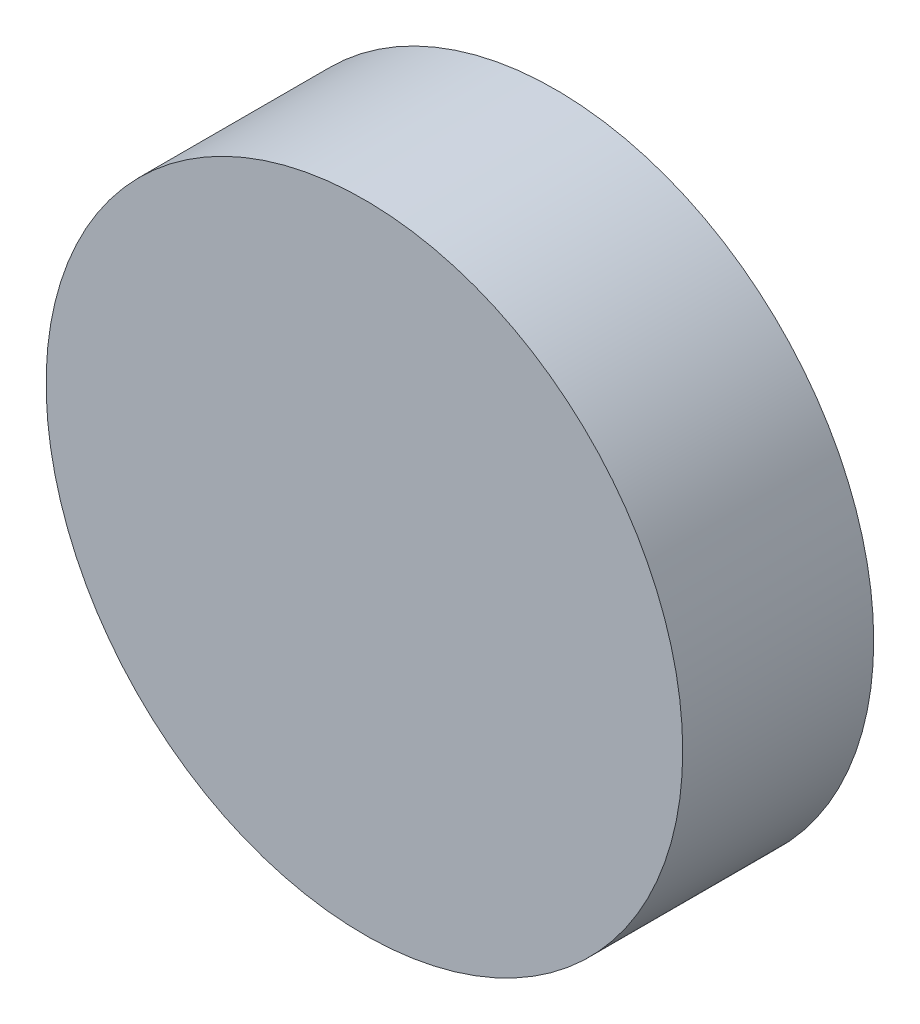
ISO-10303-21;
HEADER;
FILE_DESCRIPTION(('STEP AP214'),'2;1');
FILE_NAME('part.step','',(''),(''),'','','');
FILE_SCHEMA(('AUTOMOTIVE_DESIGN { 1 0 10303 214 1 1 1 1 }'));
ENDSEC;
DATA;
#1=APPLICATION_CONTEXT('core data for automotive mechanical design processes');
#2=APPLICATION_PROTOCOL_DEFINITION('international standard','automotive_design',2000,#1);
#3=PRODUCT_CONTEXT('',#1,'mechanical');
#4=PRODUCT('Part','Part','',(#3));
#5=PRODUCT_RELATED_PRODUCT_CATEGORY('part','',(#4));
#6=PRODUCT_DEFINITION_FORMATION('','',#4);
#7=PRODUCT_DEFINITION_CONTEXT('part definition',#1,'design');
#8=PRODUCT_DEFINITION('design','',#6,#7);
#9=PRODUCT_DEFINITION_SHAPE('','',#8);
#10=(LENGTH_UNIT() NAMED_UNIT(*) SI_UNIT(.MILLI.,.METRE.));
#11=(NAMED_UNIT(*) PLANE_ANGLE_UNIT() SI_UNIT($,.RADIAN.));
#12=(NAMED_UNIT(*) SI_UNIT($,.STERADIAN.) SOLID_ANGLE_UNIT());
#13=UNCERTAINTY_MEASURE_WITH_UNIT(LENGTH_MEASURE(1.E-05),#10,'distance_accuracy_value','');
#14=(GEOMETRIC_REPRESENTATION_CONTEXT(3) GLOBAL_UNCERTAINTY_ASSIGNED_CONTEXT((#13)) GLOBAL_UNIT_ASSIGNED_CONTEXT((#10,
#11,#12)) REPRESENTATION_CONTEXT('',''));
#15=CARTESIAN_POINT('',(0.,0.,0.));
#16=DIRECTION('',(0.,0.,1.));
#17=DIRECTION('',(1.,0.,0.));
#18=AXIS2_PLACEMENT_3D('',#15,#16,#17);
#19=CARTESIAN_POINT('',(0.,0.,3.));
#20=DIRECTION('',(0.,0.,-1.));
#21=DIRECTION('',(-1.,0.,0.));
#22=AXIS2_PLACEMENT_3D('',#19,#20,#21);
#23=CYLINDRICAL_SURFACE('',#22,5.);
#24=CARTESIAN_POINT('',(0.,0.,3.));
#25=DIRECTION('',(0.,0.,1.));
#26=DIRECTION('',(1.,0.,0.));
#27=AXIS2_PLACEMENT_3D('',#24,#25,#26);
#28=CIRCLE('',#27,5.);
#29=CARTESIAN_POINT('',(5.,0.,3.));
#30=VERTEX_POINT('',#29);
#31=EDGE_CURVE('E10',#30,#30,#28,.T.);
#32=ORIENTED_EDGE('',*,*,#31,.F.);
#33=EDGE_LOOP('',(#32));
#34=FACE_BOUND('',#33,.T.);
#35=CARTESIAN_POINT('',(0.,0.,0.));
#36=DIRECTION('',(0.,0.,1.));
#37=DIRECTION('',(1.,0.,0.));
#38=AXIS2_PLACEMENT_3D('',#35,#36,#37);
#39=CIRCLE('',#38,5.);
#40=CARTESIAN_POINT('',(5.,0.,0.));
#41=VERTEX_POINT('',#40);
#42=EDGE_CURVE('E40',#41,#41,#39,.T.);
#43=ORIENTED_EDGE('',*,*,#42,.T.);
#44=EDGE_LOOP('',(#43));
#45=FACE_BOUND('',#44,.T.);
#46=ADVANCED_FACE('F37',(#34,#45),#23,.T.);
#47=CARTESIAN_POINT('',(0.,0.,3.));
#48=DIRECTION('',(0.,0.,1.));
#49=DIRECTION('',(1.,0.,0.));
#50=AXIS2_PLACEMENT_3D('',#47,#48,#49);
#51=PLANE('',#50);
#52=ORIENTED_EDGE('',*,*,#31,.T.);
#53=EDGE_LOOP('',(#52));
#54=FACE_BOUND('',#53,.T.);
#55=ADVANCED_FACE('F54',(#54),#51,.T.);
#56=CARTESIAN_POINT('',(0.,0.,0.));
#57=DIRECTION('',(0.,0.,1.));
#58=DIRECTION('',(1.,0.,0.));
#59=AXIS2_PLACEMENT_3D('',#56,#57,#58);
#60=PLANE('',#59);
#61=ORIENTED_EDGE('',*,*,#42,.F.);
#62=EDGE_LOOP('',(#61));
#63=FACE_BOUND('',#62,.T.);
#64=ADVANCED_FACE('F52',(#63),#60,.F.);
#65=CLOSED_SHELL('',(#46,#55,#64));
#66=MANIFOLD_SOLID_BREP('B2',#65);
#67=ADVANCED_BREP_SHAPE_REPRESENTATION('',(#18,#66),#14);
#68=SHAPE_DEFINITION_REPRESENTATION(#9,#67);
ENDSEC;
END-ISO-10303-21;
